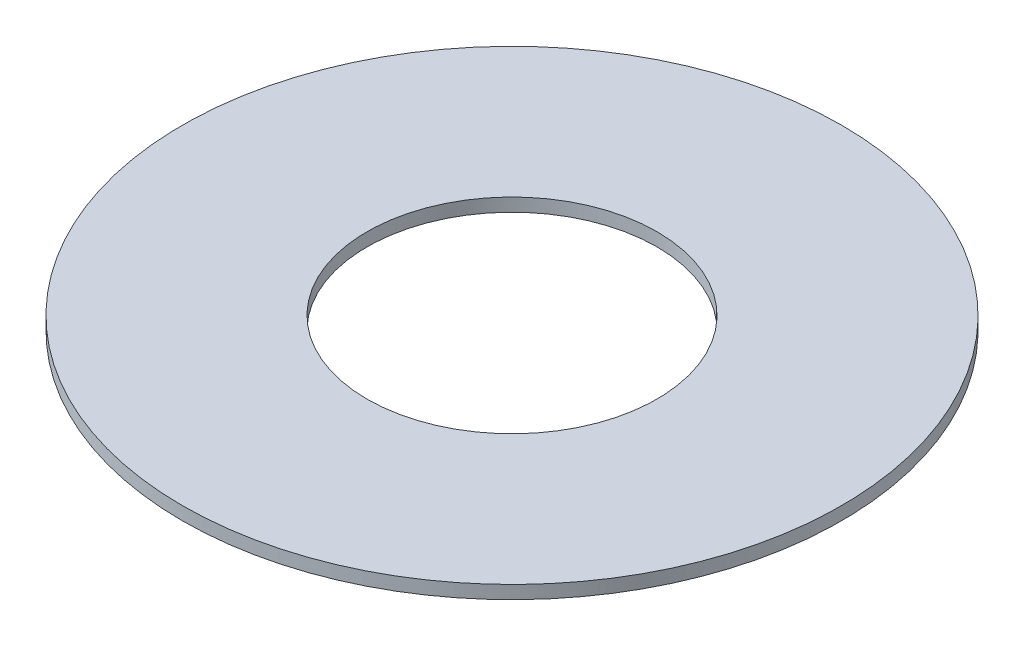
ISO-10303-21;
HEADER;
FILE_DESCRIPTION(('STEP AP214'),'2;1');
FILE_NAME('part.step','',(''),(''),'','','');
FILE_SCHEMA(('AUTOMOTIVE_DESIGN { 1 0 10303 214 1 1 1 1 }'));
ENDSEC;
DATA;
#1=APPLICATION_CONTEXT('core data for automotive mechanical design processes');
#2=APPLICATION_PROTOCOL_DEFINITION('international standard','automotive_design',2000,#1);
#3=PRODUCT_CONTEXT('',#1,'mechanical');
#4=PRODUCT('Part','Part','',(#3));
#5=PRODUCT_RELATED_PRODUCT_CATEGORY('part','',(#4));
#6=PRODUCT_DEFINITION_FORMATION('','',#4);
#7=PRODUCT_DEFINITION_CONTEXT('part definition',#1,'design');
#8=PRODUCT_DEFINITION('design','',#6,#7);
#9=PRODUCT_DEFINITION_SHAPE('','',#8);
#10=(LENGTH_UNIT() NAMED_UNIT(*) SI_UNIT(.MILLI.,.METRE.));
#11=(NAMED_UNIT(*) PLANE_ANGLE_UNIT() SI_UNIT($,.RADIAN.));
#12=(NAMED_UNIT(*) SI_UNIT($,.STERADIAN.) SOLID_ANGLE_UNIT());
#13=UNCERTAINTY_MEASURE_WITH_UNIT(LENGTH_MEASURE(1.E-05),#10,'distance_accuracy_value','');
#14=(GEOMETRIC_REPRESENTATION_CONTEXT(3) GLOBAL_UNCERTAINTY_ASSIGNED_CONTEXT((#13)) GLOBAL_UNIT_ASSIGNED_CONTEXT((#10,
#11,#12)) REPRESENTATION_CONTEXT('',''));
#15=CARTESIAN_POINT('',(0.,0.,0.));
#16=DIRECTION('',(0.,0.,1.));
#17=DIRECTION('',(1.,0.,0.));
#18=AXIS2_PLACEMENT_3D('',#15,#16,#17);
#19=CARTESIAN_POINT('',(0.,5.,0.));
#20=DIRECTION('',(0.,1.,0.));
#21=DIRECTION('',(0.,0.,1.));
#22=AXIS2_PLACEMENT_3D('',#19,#20,#21);
#23=PLANE('',#22);
#24=CARTESIAN_POINT('',(0.,5.,0.));
#25=DIRECTION('',(0.,1.,0.));
#26=DIRECTION('',(0.,0.,1.));
#27=AXIS2_PLACEMENT_3D('',#24,#25,#26);
#28=CIRCLE('',#27,125.);
#29=CARTESIAN_POINT('',(0.,5.,125.));
#30=VERTEX_POINT('',#29);
#31=EDGE_CURVE('E10',#30,#30,#28,.T.);
#32=ORIENTED_EDGE('',*,*,#31,.T.);
#33=EDGE_LOOP('',(#32));
#34=FACE_BOUND('',#33,.T.);
#35=CARTESIAN_POINT('',(0.,5.,0.));
#36=DIRECTION('',(0.,1.,0.));
#37=DIRECTION('',(0.,0.,1.));
#38=AXIS2_PLACEMENT_3D('',#35,#36,#37);
#39=CIRCLE('',#38,55.);
#40=CARTESIAN_POINT('',(0.,5.,55.));
#41=VERTEX_POINT('',#40);
#42=EDGE_CURVE('E44',#41,#41,#39,.T.);
#43=ORIENTED_EDGE('',*,*,#42,.F.);
#44=EDGE_LOOP('',(#43));
#45=FACE_BOUND('',#44,.T.);
#46=ADVANCED_FACE('F33',(#34,#45),#23,.T.);
#47=CARTESIAN_POINT('',(0.,0.,0.));
#48=DIRECTION('',(0.,1.,0.));
#49=DIRECTION('',(0.,0.,1.));
#50=AXIS2_PLACEMENT_3D('',#47,#48,#49);
#51=PLANE('',#50);
#52=CARTESIAN_POINT('',(0.,0.,0.));
#53=DIRECTION('',(0.,1.,0.));
#54=DIRECTION('',(0.,0.,1.));
#55=AXIS2_PLACEMENT_3D('',#52,#53,#54);
#56=CIRCLE('',#55,125.);
#57=CARTESIAN_POINT('',(0.,0.,125.));
#58=VERTEX_POINT('',#57);
#59=EDGE_CURVE('E37',#58,#58,#56,.T.);
#60=ORIENTED_EDGE('',*,*,#59,.F.);
#61=EDGE_LOOP('',(#60));
#62=FACE_BOUND('',#61,.T.);
#63=CARTESIAN_POINT('',(0.,0.,0.));
#64=DIRECTION('',(0.,1.,0.));
#65=DIRECTION('',(0.,0.,1.));
#66=AXIS2_PLACEMENT_3D('',#63,#64,#65);
#67=CIRCLE('',#66,55.);
#68=CARTESIAN_POINT('',(0.,0.,55.));
#69=VERTEX_POINT('',#68);
#70=EDGE_CURVE('E46',#69,#69,#67,.T.);
#71=ORIENTED_EDGE('',*,*,#70,.T.);
#72=EDGE_LOOP('',(#71));
#73=FACE_BOUND('',#72,.T.);
#74=ADVANCED_FACE('F56',(#62,#73),#51,.F.);
#75=CARTESIAN_POINT('',(0.,5.,0.));
#76=DIRECTION('',(0.,-1.,0.));
#77=DIRECTION('',(0.,0.,-1.));
#78=AXIS2_PLACEMENT_3D('',#75,#76,#77);
#79=CYLINDRICAL_SURFACE('',#78,125.);
#80=ORIENTED_EDGE('',*,*,#31,.F.);
#81=EDGE_LOOP('',(#80));
#82=FACE_BOUND('',#81,.T.);
#83=ORIENTED_EDGE('',*,*,#59,.T.);
#84=EDGE_LOOP('',(#83));
#85=FACE_BOUND('',#84,.T.);
#86=ADVANCED_FACE('F35',(#82,#85),#79,.T.);
#87=CARTESIAN_POINT('',(0.,5.,0.));
#88=DIRECTION('',(0.,-1.,0.));
#89=DIRECTION('',(0.,0.,-1.));
#90=AXIS2_PLACEMENT_3D('',#87,#88,#89);
#91=CYLINDRICAL_SURFACE('',#90,55.);
#92=ORIENTED_EDGE('',*,*,#42,.T.);
#93=EDGE_LOOP('',(#92));
#94=FACE_BOUND('',#93,.T.);
#95=ORIENTED_EDGE('',*,*,#70,.F.);
#96=EDGE_LOOP('',(#95));
#97=FACE_BOUND('',#96,.T.);
#98=ADVANCED_FACE('F52',(#94,#97),#91,.F.);
#99=CLOSED_SHELL('',(#46,#74,#86,#98));
#100=MANIFOLD_SOLID_BREP('B2',#99);
#101=ADVANCED_BREP_SHAPE_REPRESENTATION('',(#18,#100),#14);
#102=SHAPE_DEFINITION_REPRESENTATION(#9,#101);
ENDSEC;
END-ISO-10303-21;
